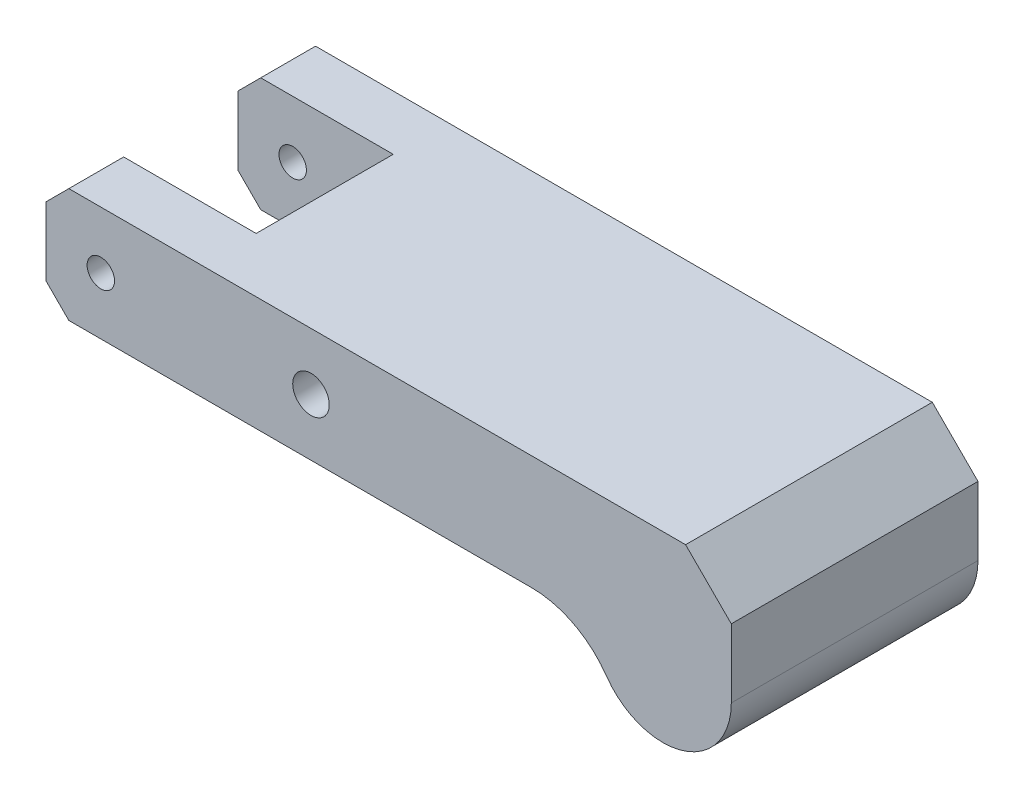
ISO-10303-21;
HEADER;
FILE_DESCRIPTION(('STEP AP214'),'2;1');
FILE_NAME('part.step','',(''),(''),'','','');
FILE_SCHEMA(('AUTOMOTIVE_DESIGN { 1 0 10303 214 1 1 1 1 }'));
ENDSEC;
DATA;
#1=APPLICATION_CONTEXT('core data for automotive mechanical design processes');
#2=APPLICATION_PROTOCOL_DEFINITION('international standard','automotive_design',2000,#1);
#3=PRODUCT_CONTEXT('',#1,'mechanical');
#4=PRODUCT('Part','Part','',(#3));
#5=PRODUCT_RELATED_PRODUCT_CATEGORY('part','',(#4));
#6=PRODUCT_DEFINITION_FORMATION('','',#4);
#7=PRODUCT_DEFINITION_CONTEXT('part definition',#1,'design');
#8=PRODUCT_DEFINITION('design','',#6,#7);
#9=PRODUCT_DEFINITION_SHAPE('','',#8);
#10=(LENGTH_UNIT() NAMED_UNIT(*) SI_UNIT(.MILLI.,.METRE.));
#11=(NAMED_UNIT(*) PLANE_ANGLE_UNIT() SI_UNIT($,.RADIAN.));
#12=(NAMED_UNIT(*) SI_UNIT($,.STERADIAN.) SOLID_ANGLE_UNIT());
#13=UNCERTAINTY_MEASURE_WITH_UNIT(LENGTH_MEASURE(1.E-05),#10,'distance_accuracy_value','');
#14=(GEOMETRIC_REPRESENTATION_CONTEXT(3) GLOBAL_UNCERTAINTY_ASSIGNED_CONTEXT((#13)) GLOBAL_UNIT_ASSIGNED_CONTEXT((#10,
#11,#12)) REPRESENTATION_CONTEXT('',''));
#15=CARTESIAN_POINT('',(0.,0.,0.));
#16=DIRECTION('',(0.,0.,1.));
#17=DIRECTION('',(1.,0.,0.));
#18=AXIS2_PLACEMENT_3D('',#15,#16,#17);
#19=CARTESIAN_POINT('',(-75.0000000000001,-12.5,54.));
#20=DIRECTION('',(1.,0.,0.));
#21=DIRECTION('',(0.,0.,-1.));
#22=AXIS2_PLACEMENT_3D('',#19,#20,#21);
#23=PLANE('',#22);
#24=DIRECTION('',(0.,1.,0.));
#25=VECTOR('',#24,1.);
#26=CARTESIAN_POINT('',(-75.0000000000001,-12.5,12.));
#27=LINE('',#26,#25);
#28=CARTESIAN_POINT('',(-75.0000000000001,-7.5,12.));
#29=VERTEX_POINT('',#28);
#30=CARTESIAN_POINT('',(-75.0000000000001,7.49999999999998,12.));
#31=VERTEX_POINT('',#30);
#32=EDGE_CURVE('E192',#29,#31,#27,.T.);
#33=ORIENTED_EDGE('',*,*,#32,.T.);
#34=DIRECTION('',(0.,0.,-1.));
#35=VECTOR('',#34,1.);
#36=CARTESIAN_POINT('',(-75.0000000000001,7.49999999999998,54.));
#37=LINE('',#36,#35);
#38=CARTESIAN_POINT('',(-75.0000000000001,7.49999999999998,0.));
#39=VERTEX_POINT('',#38);
#40=EDGE_CURVE('E261',#31,#39,#37,.T.);
#41=ORIENTED_EDGE('',*,*,#40,.T.);
#42=DIRECTION('',(0.,-1.,0.));
#43=VECTOR('',#42,1.);
#44=CARTESIAN_POINT('',(-75.0000000000001,-12.5,0.));
#45=LINE('',#44,#43);
#46=CARTESIAN_POINT('',(-75.0000000000001,-7.5,0.));
#47=VERTEX_POINT('',#46);
#48=EDGE_CURVE('E220',#39,#47,#45,.T.);
#49=ORIENTED_EDGE('',*,*,#48,.T.);
#50=DIRECTION('',(0.,0.,1.));
#51=VECTOR('',#50,1.);
#52=CARTESIAN_POINT('',(-75.0000000000001,-7.5,54.));
#53=LINE('',#52,#51);
#54=EDGE_CURVE('E253',#47,#29,#53,.T.);
#55=ORIENTED_EDGE('',*,*,#54,.T.);
#56=EDGE_LOOP('',(#33,#41,#49,#55));
#57=FACE_BOUND('',#56,.T.);
#58=ADVANCED_FACE('F40',(#57),#23,.F.);
#59=DIRECTION('',(0.,-1.,0.));
#60=VECTOR('',#59,1.);
#61=CARTESIAN_POINT('',(-75.0000000000001,-12.5,54.));
#62=LINE('',#61,#60);
#63=CARTESIAN_POINT('',(-75.0000000000001,7.49999999999998,54.));
#64=VERTEX_POINT('',#63);
#65=CARTESIAN_POINT('',(-75.0000000000001,-7.5,54.));
#66=VERTEX_POINT('',#65);
#67=EDGE_CURVE('E224',#64,#66,#62,.T.);
#68=ORIENTED_EDGE('',*,*,#67,.F.);
#69=DIRECTION('',(0.,0.,-1.));
#70=VECTOR('',#69,1.);
#71=CARTESIAN_POINT('',(-75.0000000000001,7.49999999999998,54.));
#72=LINE('',#71,#70);
#73=CARTESIAN_POINT('',(-75.0000000000001,7.49999999999998,42.));
#74=VERTEX_POINT('',#73);
#75=EDGE_CURVE('E288',#64,#74,#72,.T.);
#76=ORIENTED_EDGE('',*,*,#75,.T.);
#77=DIRECTION('',(0.,1.,0.));
#78=VECTOR('',#77,1.);
#79=CARTESIAN_POINT('',(-75.0000000000001,-12.5,42.));
#80=LINE('',#79,#78);
#81=CARTESIAN_POINT('',(-75.0000000000001,-7.5,42.));
#82=VERTEX_POINT('',#81);
#83=EDGE_CURVE('E172',#82,#74,#80,.T.);
#84=ORIENTED_EDGE('',*,*,#83,.F.);
#85=DIRECTION('',(0.,0.,1.));
#86=VECTOR('',#85,1.);
#87=CARTESIAN_POINT('',(-75.0000000000001,-7.5,54.));
#88=LINE('',#87,#86);
#89=EDGE_CURVE('E285',#82,#66,#88,.T.);
#90=ORIENTED_EDGE('',*,*,#89,.T.);
#91=EDGE_LOOP('',(#68,#76,#84,#90));
#92=FACE_BOUND('',#91,.T.);
#93=ADVANCED_FACE('F343',(#92),#23,.F.);
#94=CARTESIAN_POINT('',(74.9999999999999,-12.5,54.));
#95=DIRECTION('',(0.,1.,0.));
#96=DIRECTION('',(-1.,0.,0.));
#97=AXIS2_PLACEMENT_3D('',#94,#95,#96);
#98=PLANE('',#97);
#99=DIRECTION('',(1.,0.,0.));
#100=VECTOR('',#99,1.);
#101=CARTESIAN_POINT('',(74.9999999999999,-12.5,54.));
#102=LINE('',#101,#100);
#103=CARTESIAN_POINT('',(-70.0000000000001,-12.5,54.));
#104=VERTEX_POINT('',#103);
#105=CARTESIAN_POINT('',(31.2771867673098,-12.5,54.));
#106=VERTEX_POINT('',#105);
#107=EDGE_CURVE('E228',#104,#106,#102,.T.);
#108=ORIENTED_EDGE('',*,*,#107,.F.);
#109=DIRECTION('',(0.,0.,-1.));
#110=VECTOR('',#109,1.);
#111=CARTESIAN_POINT('',(-70.0000000000001,-12.5,54.));
#112=LINE('',#111,#110);
#113=CARTESIAN_POINT('',(-70.0000000000001,-12.5,42.));
#114=VERTEX_POINT('',#113);
#115=EDGE_CURVE('E156',#104,#114,#112,.T.);
#116=ORIENTED_EDGE('',*,*,#115,.T.);
#117=DIRECTION('',(1.,0.,0.));
#118=VECTOR('',#117,1.);
#119=CARTESIAN_POINT('',(-75.0000000000001,-12.5,42.));
#120=LINE('',#119,#118);
#121=CARTESIAN_POINT('',(-41.,-12.5,42.));
#122=VERTEX_POINT('',#121);
#123=EDGE_CURVE('E148',#114,#122,#120,.T.);
#124=ORIENTED_EDGE('',*,*,#123,.T.);
#125=DIRECTION('',(0.,0.,-1.));
#126=VECTOR('',#125,1.);
#127=CARTESIAN_POINT('',(-41.,-12.5,42.));
#128=LINE('',#127,#126);
#129=CARTESIAN_POINT('',(-41.,-12.5,12.));
#130=VERTEX_POINT('',#129);
#131=EDGE_CURVE('E154',#122,#130,#128,.T.);
#132=ORIENTED_EDGE('',*,*,#131,.T.);
#133=DIRECTION('',(-1.,0.,0.));
#134=VECTOR('',#133,1.);
#135=CARTESIAN_POINT('',(-75.0000000000001,-12.5,12.));
#136=LINE('',#135,#134);
#137=CARTESIAN_POINT('',(-70.0000000000001,-12.5,12.));
#138=VERTEX_POINT('',#137);
#139=EDGE_CURVE('E177',#130,#138,#136,.T.);
#140=ORIENTED_EDGE('',*,*,#139,.T.);
#141=DIRECTION('',(0.,0.,-1.));
#142=VECTOR('',#141,1.);
#143=CARTESIAN_POINT('',(-70.0000000000001,-12.5,54.));
#144=LINE('',#143,#142);
#145=CARTESIAN_POINT('',(-70.0000000000001,-12.5,0.));
#146=VERTEX_POINT('',#145);
#147=EDGE_CURVE('E304',#138,#146,#144,.T.);
#148=ORIENTED_EDGE('',*,*,#147,.T.);
#149=DIRECTION('',(1.,0.,0.));
#150=VECTOR('',#149,1.);
#151=CARTESIAN_POINT('',(74.9999999999999,-12.5,0.));
#152=LINE('',#151,#150);
#153=CARTESIAN_POINT('',(31.2771867673098,-12.5,0.));
#154=VERTEX_POINT('',#153);
#155=EDGE_CURVE('E242',#146,#154,#152,.T.);
#156=ORIENTED_EDGE('',*,*,#155,.T.);
#157=DIRECTION('',(0.,0.,-1.));
#158=VECTOR('',#157,1.);
#159=CARTESIAN_POINT('',(31.2771867673098,-12.5,54.));
#160=LINE('',#159,#158);
#161=EDGE_CURVE('E210',#106,#154,#160,.T.);
#162=ORIENTED_EDGE('',*,*,#161,.F.);
#163=EDGE_LOOP('',(#108,#116,#124,#132,#140,#148,#156,#162));
#164=FACE_BOUND('',#163,.T.);
#165=ADVANCED_FACE('F151',(#164),#98,.F.);
#166=CARTESIAN_POINT('',(74.9999999999999,-12.5,54.));
#167=DIRECTION('',(-1.,0.,0.));
#168=DIRECTION('',(0.,0.,1.));
#169=AXIS2_PLACEMENT_3D('',#166,#167,#168);
#170=PLANE('',#169);
#171=DIRECTION('',(0.,1.,0.));
#172=VECTOR('',#171,1.);
#173=CARTESIAN_POINT('',(74.9999999999999,-12.5,0.));
#174=LINE('',#173,#172);
#175=CARTESIAN_POINT('',(74.9999999999999,-12.5,0.));
#176=VERTEX_POINT('',#175);
#177=CARTESIAN_POINT('',(74.9999999999999,2.49999999999996,0.));
#178=VERTEX_POINT('',#177);
#179=EDGE_CURVE('E245',#176,#178,#174,.T.);
#180=ORIENTED_EDGE('',*,*,#179,.T.);
#181=DIRECTION('',(0.,0.,1.));
#182=VECTOR('',#181,1.);
#183=CARTESIAN_POINT('',(74.9999999999999,2.49999999999996,54.));
#184=LINE('',#183,#182);
#185=CARTESIAN_POINT('',(74.9999999999999,2.49999999999996,54.));
#186=VERTEX_POINT('',#185);
#187=EDGE_CURVE('E50',#178,#186,#184,.T.);
#188=ORIENTED_EDGE('',*,*,#187,.T.);
#189=DIRECTION('',(0.,1.,0.));
#190=VECTOR('',#189,1.);
#191=CARTESIAN_POINT('',(74.9999999999999,-12.5,54.));
#192=LINE('',#191,#190);
#193=CARTESIAN_POINT('',(74.9999999999999,-12.5,54.));
#194=VERTEX_POINT('',#193);
#195=EDGE_CURVE('E232',#194,#186,#192,.T.);
#196=ORIENTED_EDGE('',*,*,#195,.F.);
#197=DIRECTION('',(0.,0.,-1.));
#198=VECTOR('',#197,1.);
#199=CARTESIAN_POINT('',(74.9999999999999,-12.5,54.));
#200=LINE('',#199,#198);
#201=EDGE_CURVE('E238',#194,#176,#200,.T.);
#202=ORIENTED_EDGE('',*,*,#201,.T.);
#203=EDGE_LOOP('',(#180,#188,#196,#202));
#204=FACE_BOUND('',#203,.T.);
#205=ADVANCED_FACE('F359',(#204),#170,.F.);
#206=CARTESIAN_POINT('',(74.9999999999999,12.5,54.));
#207=DIRECTION('',(0.,-1.,0.));
#208=DIRECTION('',(1.,0.,0.));
#209=AXIS2_PLACEMENT_3D('',#206,#207,#208);
#210=PLANE('',#209);
#211=DIRECTION('',(-1.,0.,0.));
#212=VECTOR('',#211,1.);
#213=CARTESIAN_POINT('',(74.9999999999999,12.5,54.));
#214=LINE('',#213,#212);
#215=CARTESIAN_POINT('',(64.9999999999999,12.5,54.));
#216=VERTEX_POINT('',#215);
#217=CARTESIAN_POINT('',(-70.,12.5,54.));
#218=VERTEX_POINT('',#217);
#219=EDGE_CURVE('E235',#216,#218,#214,.T.);
#220=ORIENTED_EDGE('',*,*,#219,.F.);
#221=DIRECTION('',(0.,0.,-1.));
#222=VECTOR('',#221,1.);
#223=CARTESIAN_POINT('',(64.9999999999999,12.5,54.));
#224=LINE('',#223,#222);
#225=CARTESIAN_POINT('',(64.9999999999999,12.5,0.));
#226=VERTEX_POINT('',#225);
#227=EDGE_CURVE('E310',#216,#226,#224,.T.);
#228=ORIENTED_EDGE('',*,*,#227,.T.);
#229=DIRECTION('',(-1.,0.,0.));
#230=VECTOR('',#229,1.);
#231=CARTESIAN_POINT('',(74.9999999999999,12.5,0.));
#232=LINE('',#231,#230);
#233=CARTESIAN_POINT('',(-70.,12.5,0.));
#234=VERTEX_POINT('',#233);
#235=EDGE_CURVE('E229',#226,#234,#232,.T.);
#236=ORIENTED_EDGE('',*,*,#235,.T.);
#237=DIRECTION('',(0.,0.,1.));
#238=VECTOR('',#237,1.);
#239=CARTESIAN_POINT('',(-70.,12.5,54.));
#240=LINE('',#239,#238);
#241=CARTESIAN_POINT('',(-70.,12.5,12.));
#242=VERTEX_POINT('',#241);
#243=EDGE_CURVE('E276',#234,#242,#240,.T.);
#244=ORIENTED_EDGE('',*,*,#243,.T.);
#245=DIRECTION('',(-1.,0.,0.));
#246=VECTOR('',#245,1.);
#247=CARTESIAN_POINT('',(-75.0000000000001,12.5,12.));
#248=LINE('',#247,#246);
#249=CARTESIAN_POINT('',(-41.,12.5,12.));
#250=VERTEX_POINT('',#249);
#251=EDGE_CURVE('E159',#250,#242,#248,.T.);
#252=ORIENTED_EDGE('',*,*,#251,.F.);
#253=DIRECTION('',(0.,0.,-1.));
#254=VECTOR('',#253,1.);
#255=CARTESIAN_POINT('',(-41.,12.5,42.));
#256=LINE('',#255,#254);
#257=CARTESIAN_POINT('',(-41.,12.5,42.));
#258=VERTEX_POINT('',#257);
#259=EDGE_CURVE('E185',#258,#250,#256,.T.);
#260=ORIENTED_EDGE('',*,*,#259,.F.);
#261=DIRECTION('',(1.,0.,0.));
#262=VECTOR('',#261,1.);
#263=CARTESIAN_POINT('',(-75.0000000000001,12.5,42.));
#264=LINE('',#263,#262);
#265=CARTESIAN_POINT('',(-70.,12.5,42.));
#266=VERTEX_POINT('',#265);
#267=EDGE_CURVE('E166',#266,#258,#264,.T.);
#268=ORIENTED_EDGE('',*,*,#267,.F.);
#269=DIRECTION('',(0.,0.,1.));
#270=VECTOR('',#269,1.);
#271=CARTESIAN_POINT('',(-70.,12.5,54.));
#272=LINE('',#271,#270);
#273=EDGE_CURVE('E272',#266,#218,#272,.T.);
#274=ORIENTED_EDGE('',*,*,#273,.T.);
#275=EDGE_LOOP('',(#220,#228,#236,#244,#252,#260,#268,#274));
#276=FACE_BOUND('',#275,.T.);
#277=ADVANCED_FACE('F319',(#276),#210,.F.);
#278=CARTESIAN_POINT('',(0.,0.,54.));
#279=DIRECTION('',(0.,0.,1.));
#280=DIRECTION('',(1.,0.,0.));
#281=AXIS2_PLACEMENT_3D('',#278,#279,#280);
#282=PLANE('',#281);
#283=CARTESIAN_POINT('',(-17.,0.,54.));
#284=DIRECTION('',(0.,0.,-1.));
#285=DIRECTION('',(-1.,0.,0.));
#286=AXIS2_PLACEMENT_3D('',#283,#284,#285);
#287=CIRCLE('',#286,4.);
#288=CARTESIAN_POINT('',(-21.,0.,54.));
#289=VERTEX_POINT('',#288);
#290=EDGE_CURVE('E258',#289,#289,#287,.T.);
#291=ORIENTED_EDGE('',*,*,#290,.T.);
#292=EDGE_LOOP('',(#291));
#293=FACE_BOUND('',#292,.T.);
#294=CARTESIAN_POINT('',(-63.0000000000001,0.,54.));
#295=DIRECTION('',(0.,0.,-1.));
#296=DIRECTION('',(-1.,0.,0.));
#297=AXIS2_PLACEMENT_3D('',#294,#295,#296);
#298=CIRCLE('',#297,3.00000000000001);
#299=CARTESIAN_POINT('',(-66.0000000000001,0.,54.));
#300=VERTEX_POINT('',#299);
#301=EDGE_CURVE('E552',#300,#300,#298,.T.);
#302=ORIENTED_EDGE('',*,*,#301,.T.);
#303=EDGE_LOOP('',(#302));
#304=FACE_BOUND('',#303,.T.);
#305=ORIENTED_EDGE('',*,*,#195,.T.);
#306=DIRECTION('',(0.707106781186546,-0.70710678118655,0.));
#307=VECTOR('',#306,1.);
#308=CARTESIAN_POINT('',(38.7500000000002,38.75,54.));
#309=LINE('',#308,#307);
#310=EDGE_CURVE('E11',#186,#216,#309,.F.);
#311=ORIENTED_EDGE('',*,*,#310,.T.);
#312=ORIENTED_EDGE('',*,*,#219,.T.);
#313=DIRECTION('',(0.707106781186549,0.707106781186547,0.));
#314=VECTOR('',#313,1.);
#315=CARTESIAN_POINT('',(-41.2499999999999,41.25,54.));
#316=LINE('',#315,#314);
#317=EDGE_CURVE('E301',#218,#64,#316,.F.);
#318=ORIENTED_EDGE('',*,*,#317,.T.);
#319=ORIENTED_EDGE('',*,*,#67,.T.);
#320=DIRECTION('',(-0.707106781186546,0.70710678118655,0.));
#321=VECTOR('',#320,1.);
#322=CARTESIAN_POINT('',(-41.2500000000002,-41.25,54.));
#323=LINE('',#322,#321);
#324=EDGE_CURVE('E298',#66,#104,#323,.F.);
#325=ORIENTED_EDGE('',*,*,#324,.T.);
#326=ORIENTED_EDGE('',*,*,#107,.T.);
#327=CARTESIAN_POINT('',(31.2771867673098,-32.5,54.));
#328=DIRECTION('',(0.,0.,1.));
#329=DIRECTION('',(-1.,0.,0.));
#330=AXIS2_PLACEMENT_3D('',#327,#328,#329);
#331=CIRCLE('',#330,20.);
#332=CARTESIAN_POINT('',(47.6902229002756,-21.0714285714286,54.));
#333=VERTEX_POINT('',#332);
#334=EDGE_CURVE('E201',#333,#106,#331,.T.);
#335=ORIENTED_EDGE('',*,*,#334,.F.);
#336=CARTESIAN_POINT('',(60.,-12.5,54.));
#337=DIRECTION('',(0.,0.,-1.));
#338=DIRECTION('',(-1.,0.,0.));
#339=AXIS2_PLACEMENT_3D('',#336,#337,#338);
#340=CIRCLE('',#339,15.);
#341=EDGE_CURVE('E205',#194,#333,#340,.T.);
#342=ORIENTED_EDGE('',*,*,#341,.F.);
#343=EDGE_LOOP('',(#305,#311,#312,#318,#319,#325,#326,#335,#342));
#344=FACE_BOUND('',#343,.T.);
#345=ADVANCED_FACE('F340',(#293,#304,#344),#282,.T.);
#346=CARTESIAN_POINT('',(0.,0.,0.));
#347=DIRECTION('',(0.,0.,1.));
#348=DIRECTION('',(1.,0.,0.));
#349=AXIS2_PLACEMENT_3D('',#346,#347,#348);
#350=PLANE('',#349);
#351=CARTESIAN_POINT('',(-17.,0.,0.));
#352=DIRECTION('',(0.,0.,-1.));
#353=DIRECTION('',(-1.,0.,0.));
#354=AXIS2_PLACEMENT_3D('',#351,#352,#353);
#355=CIRCLE('',#354,4.);
#356=CARTESIAN_POINT('',(-21.,0.,0.));
#357=VERTEX_POINT('',#356);
#358=EDGE_CURVE('E550',#357,#357,#355,.T.);
#359=ORIENTED_EDGE('',*,*,#358,.F.);
#360=EDGE_LOOP('',(#359));
#361=FACE_BOUND('',#360,.T.);
#362=CARTESIAN_POINT('',(-63.0000000000001,0.,0.));
#363=DIRECTION('',(0.,0.,-1.));
#364=DIRECTION('',(-1.,0.,0.));
#365=AXIS2_PLACEMENT_3D('',#362,#363,#364);
#366=CIRCLE('',#365,3.00000000000001);
#367=CARTESIAN_POINT('',(-66.0000000000001,0.,0.));
#368=VERTEX_POINT('',#367);
#369=EDGE_CURVE('E558',#368,#368,#366,.T.);
#370=ORIENTED_EDGE('',*,*,#369,.F.);
#371=EDGE_LOOP('',(#370));
#372=FACE_BOUND('',#371,.T.);
#373=ORIENTED_EDGE('',*,*,#235,.F.);
#374=DIRECTION('',(-0.707106781186546,0.70710678118655,0.));
#375=VECTOR('',#374,1.);
#376=CARTESIAN_POINT('',(64.9999999999999,12.5,0.));
#377=LINE('',#376,#375);
#378=EDGE_CURVE('E64',#226,#178,#377,.F.);
#379=ORIENTED_EDGE('',*,*,#378,.T.);
#380=ORIENTED_EDGE('',*,*,#179,.F.);
#381=CARTESIAN_POINT('',(60.,-12.5,0.));
#382=DIRECTION('',(0.,0.,-1.));
#383=DIRECTION('',(-1.,0.,0.));
#384=AXIS2_PLACEMENT_3D('',#381,#382,#383);
#385=CIRCLE('',#384,15.);
#386=CARTESIAN_POINT('',(47.6902229002756,-21.0714285714286,0.));
#387=VERTEX_POINT('',#386);
#388=EDGE_CURVE('E206',#176,#387,#385,.T.);
#389=ORIENTED_EDGE('',*,*,#388,.T.);
#390=CARTESIAN_POINT('',(31.2771867673098,-32.5,0.));
#391=DIRECTION('',(0.,0.,1.));
#392=DIRECTION('',(-1.,0.,0.));
#393=AXIS2_PLACEMENT_3D('',#390,#391,#392);
#394=CIRCLE('',#393,20.);
#395=EDGE_CURVE('E196',#387,#154,#394,.T.);
#396=ORIENTED_EDGE('',*,*,#395,.T.);
#397=ORIENTED_EDGE('',*,*,#155,.F.);
#398=DIRECTION('',(0.707106781186546,-0.70710678118655,0.));
#399=VECTOR('',#398,1.);
#400=CARTESIAN_POINT('',(-70.0000000000001,-12.5,0.));
#401=LINE('',#400,#399);
#402=EDGE_CURVE('E265',#146,#47,#401,.F.);
#403=ORIENTED_EDGE('',*,*,#402,.T.);
#404=ORIENTED_EDGE('',*,*,#48,.F.);
#405=DIRECTION('',(-0.707106781186549,-0.707106781186547,0.));
#406=VECTOR('',#405,1.);
#407=CARTESIAN_POINT('',(-75.0000000000001,7.49999999999998,0.));
#408=LINE('',#407,#406);
#409=EDGE_CURVE('E268',#39,#234,#408,.F.);
#410=ORIENTED_EDGE('',*,*,#409,.T.);
#411=EDGE_LOOP('',(#373,#379,#380,#389,#396,#397,#403,#404,#410));
#412=FACE_BOUND('',#411,.T.);
#413=ADVANCED_FACE('F322',(#361,#372,#412),#350,.F.);
#414=CARTESIAN_POINT('',(31.2771867673098,-32.5,54.));
#415=DIRECTION('',(0.,0.,-1.));
#416=DIRECTION('',(-1.,0.,0.));
#417=AXIS2_PLACEMENT_3D('',#414,#415,#416);
#418=CYLINDRICAL_SURFACE('',#417,20.);
#419=ORIENTED_EDGE('',*,*,#395,.F.);
#420=DIRECTION('',(0.,0.,-1.));
#421=VECTOR('',#420,1.);
#422=CARTESIAN_POINT('',(47.6902229002756,-21.0714285714286,54.));
#423=LINE('',#422,#421);
#424=EDGE_CURVE('E217',#333,#387,#423,.T.);
#425=ORIENTED_EDGE('',*,*,#424,.F.);
#426=ORIENTED_EDGE('',*,*,#334,.T.);
#427=ORIENTED_EDGE('',*,*,#161,.T.);
#428=EDGE_LOOP('',(#419,#425,#426,#427));
#429=FACE_BOUND('',#428,.T.);
#430=ADVANCED_FACE('F353',(#429),#418,.F.);
#431=CARTESIAN_POINT('',(60.,-12.5,54.));
#432=DIRECTION('',(0.,0.,-1.));
#433=DIRECTION('',(-1.,0.,0.));
#434=AXIS2_PLACEMENT_3D('',#431,#432,#433);
#435=CYLINDRICAL_SURFACE('',#434,15.);
#436=ORIENTED_EDGE('',*,*,#388,.F.);
#437=ORIENTED_EDGE('',*,*,#201,.F.);
#438=ORIENTED_EDGE('',*,*,#341,.T.);
#439=ORIENTED_EDGE('',*,*,#424,.T.);
#440=EDGE_LOOP('',(#436,#437,#438,#439));
#441=FACE_BOUND('',#440,.T.);
#442=ADVANCED_FACE('F358',(#441),#435,.T.);
#443=CARTESIAN_POINT('',(-75.0000000000001,-12.5,12.));
#444=DIRECTION('',(0.,0.,-1.));
#445=DIRECTION('',(-1.,0.,0.));
#446=AXIS2_PLACEMENT_3D('',#443,#444,#445);
#447=PLANE('',#446);
#448=CARTESIAN_POINT('',(-63.0000000000001,0.,12.));
#449=DIRECTION('',(0.,0.,-1.));
#450=DIRECTION('',(-1.,0.,0.));
#451=AXIS2_PLACEMENT_3D('',#448,#449,#450);
#452=CIRCLE('',#451,3.00000000000001);
#453=CARTESIAN_POINT('',(-66.0000000000001,0.,12.));
#454=VERTEX_POINT('',#453);
#455=EDGE_CURVE('E186',#454,#454,#452,.T.);
#456=ORIENTED_EDGE('',*,*,#455,.T.);
#457=EDGE_LOOP('',(#456));
#458=FACE_BOUND('',#457,.T.);
#459=ORIENTED_EDGE('',*,*,#251,.T.);
#460=DIRECTION('',(0.707106781186549,0.707106781186547,0.));
#461=VECTOR('',#460,1.);
#462=CARTESIAN_POINT('',(-75.0000000000001,7.49999999999998,12.));
#463=LINE('',#462,#461);
#464=EDGE_CURVE('E282',#242,#31,#463,.F.);
#465=ORIENTED_EDGE('',*,*,#464,.T.);
#466=ORIENTED_EDGE('',*,*,#32,.F.);
#467=DIRECTION('',(-0.707106781186546,0.70710678118655,0.));
#468=VECTOR('',#467,1.);
#469=CARTESIAN_POINT('',(-70.0000000000001,-12.5,12.));
#470=LINE('',#469,#468);
#471=EDGE_CURVE('E279',#29,#138,#470,.F.);
#472=ORIENTED_EDGE('',*,*,#471,.T.);
#473=ORIENTED_EDGE('',*,*,#139,.F.);
#474=DIRECTION('',(0.,1.,0.));
#475=VECTOR('',#474,1.);
#476=CARTESIAN_POINT('',(-41.,-12.5,12.));
#477=LINE('',#476,#475);
#478=EDGE_CURVE('E171',#130,#250,#477,.T.);
#479=ORIENTED_EDGE('',*,*,#478,.T.);
#480=EDGE_LOOP('',(#459,#465,#466,#472,#473,#479));
#481=FACE_BOUND('',#480,.T.);
#482=ADVANCED_FACE('F331',(#458,#481),#447,.F.);
#483=CARTESIAN_POINT('',(-41.,-12.5,42.));
#484=DIRECTION('',(1.,0.,0.));
#485=DIRECTION('',(0.,1.,0.));
#486=AXIS2_PLACEMENT_3D('',#483,#484,#485);
#487=PLANE('',#486);
#488=ORIENTED_EDGE('',*,*,#259,.T.);
#489=ORIENTED_EDGE('',*,*,#478,.F.);
#490=ORIENTED_EDGE('',*,*,#131,.F.);
#491=DIRECTION('',(0.,1.,0.));
#492=VECTOR('',#491,1.);
#493=CARTESIAN_POINT('',(-41.,-12.5,42.));
#494=LINE('',#493,#492);
#495=EDGE_CURVE('E162',#122,#258,#494,.T.);
#496=ORIENTED_EDGE('',*,*,#495,.T.);
#497=EDGE_LOOP('',(#488,#489,#490,#496));
#498=FACE_BOUND('',#497,.T.);
#499=ADVANCED_FACE('F174',(#498),#487,.F.);
#500=CARTESIAN_POINT('',(-75.0000000000001,-12.5,42.));
#501=DIRECTION('',(0.,0.,1.));
#502=DIRECTION('',(1.,0.,0.));
#503=AXIS2_PLACEMENT_3D('',#500,#501,#502);
#504=PLANE('',#503);
#505=CARTESIAN_POINT('',(-63.0000000000001,0.,42.));
#506=DIRECTION('',(0.,0.,1.));
#507=DIRECTION('',(1.,0.,0.));
#508=AXIS2_PLACEMENT_3D('',#505,#506,#507);
#509=CIRCLE('',#508,3.00000000000001);
#510=CARTESIAN_POINT('',(-60.,0.,42.));
#511=VERTEX_POINT('',#510);
#512=EDGE_CURVE('E254',#511,#511,#509,.T.);
#513=ORIENTED_EDGE('',*,*,#512,.T.);
#514=EDGE_LOOP('',(#513));
#515=FACE_BOUND('',#514,.T.);
#516=ORIENTED_EDGE('',*,*,#83,.T.);
#517=DIRECTION('',(-0.707106781186549,-0.707106781186547,0.));
#518=VECTOR('',#517,1.);
#519=CARTESIAN_POINT('',(-75.0000000000001,7.49999999999998,42.));
#520=LINE('',#519,#518);
#521=EDGE_CURVE('E295',#74,#266,#520,.F.);
#522=ORIENTED_EDGE('',*,*,#521,.T.);
#523=ORIENTED_EDGE('',*,*,#267,.T.);
#524=ORIENTED_EDGE('',*,*,#495,.F.);
#525=ORIENTED_EDGE('',*,*,#123,.F.);
#526=DIRECTION('',(0.707106781186546,-0.70710678118655,0.));
#527=VECTOR('',#526,1.);
#528=CARTESIAN_POINT('',(-70.0000000000001,-12.5,42.));
#529=LINE('',#528,#527);
#530=EDGE_CURVE('E292',#114,#82,#529,.F.);
#531=ORIENTED_EDGE('',*,*,#530,.T.);
#532=EDGE_LOOP('',(#516,#522,#523,#524,#525,#531));
#533=FACE_BOUND('',#532,.T.);
#534=ADVANCED_FACE('F164',(#515,#533),#504,.F.);
#535=CARTESIAN_POINT('',(-63.0000000000001,0.,54.));
#536=DIRECTION('',(0.,0.,-1.));
#537=DIRECTION('',(-1.,0.,0.));
#538=AXIS2_PLACEMENT_3D('',#535,#536,#537);
#539=CYLINDRICAL_SURFACE('',#538,3.00000000000001);
#540=ORIENTED_EDGE('',*,*,#301,.F.);
#541=EDGE_LOOP('',(#540));
#542=FACE_BOUND('',#541,.T.);
#543=ORIENTED_EDGE('',*,*,#512,.F.);
#544=EDGE_LOOP('',(#543));
#545=FACE_BOUND('',#544,.T.);
#546=ADVANCED_FACE('F479',(#542,#545),#539,.F.);
#547=ORIENTED_EDGE('',*,*,#369,.T.);
#548=EDGE_LOOP('',(#547));
#549=FACE_BOUND('',#548,.T.);
#550=ORIENTED_EDGE('',*,*,#455,.F.);
#551=EDGE_LOOP('',(#550));
#552=FACE_BOUND('',#551,.T.);
#553=ADVANCED_FACE('F487',(#549,#552),#539,.F.);
#554=CARTESIAN_POINT('',(-17.,0.,54.));
#555=DIRECTION('',(0.,0.,-1.));
#556=DIRECTION('',(-1.,0.,0.));
#557=AXIS2_PLACEMENT_3D('',#554,#555,#556);
#558=CYLINDRICAL_SURFACE('',#557,4.);
#559=ORIENTED_EDGE('',*,*,#290,.F.);
#560=EDGE_LOOP('',(#559));
#561=FACE_BOUND('',#560,.T.);
#562=ORIENTED_EDGE('',*,*,#358,.T.);
#563=EDGE_LOOP('',(#562));
#564=FACE_BOUND('',#563,.T.);
#565=ADVANCED_FACE('F381',(#561,#564),#558,.F.);
#566=CARTESIAN_POINT('',(-75.0000000000001,7.49999999999998,54.));
#567=DIRECTION('',(0.707106781186546,-0.707106781186548,0.));
#568=DIRECTION('',(0.,0.,-1.));
#569=AXIS2_PLACEMENT_3D('',#566,#567,#568);
#570=PLANE('',#569);
#571=ORIENTED_EDGE('',*,*,#464,.F.);
#572=ORIENTED_EDGE('',*,*,#243,.F.);
#573=ORIENTED_EDGE('',*,*,#409,.F.);
#574=ORIENTED_EDGE('',*,*,#40,.F.);
#575=EDGE_LOOP('',(#571,#572,#573,#574));
#576=FACE_BOUND('',#575,.T.);
#577=ADVANCED_FACE('F328',(#576),#570,.F.);
#578=CARTESIAN_POINT('',(-75.0000000000001,7.49999999999998,54.));
#579=DIRECTION('',(0.707106781186546,-0.707106781186548,0.));
#580=DIRECTION('',(0.,0.,-1.));
#581=AXIS2_PLACEMENT_3D('',#578,#579,#580);
#582=PLANE('',#581);
#583=ORIENTED_EDGE('',*,*,#317,.F.);
#584=ORIENTED_EDGE('',*,*,#273,.F.);
#585=ORIENTED_EDGE('',*,*,#521,.F.);
#586=ORIENTED_EDGE('',*,*,#75,.F.);
#587=EDGE_LOOP('',(#583,#584,#585,#586));
#588=FACE_BOUND('',#587,.T.);
#589=ADVANCED_FACE('F336',(#588),#582,.F.);
#590=CARTESIAN_POINT('',(-70.0000000000001,-12.5,54.));
#591=DIRECTION('',(0.70710678118655,0.707106781186546,0.));
#592=DIRECTION('',(0.,0.,-1.));
#593=AXIS2_PLACEMENT_3D('',#590,#591,#592);
#594=PLANE('',#593);
#595=ORIENTED_EDGE('',*,*,#324,.F.);
#596=ORIENTED_EDGE('',*,*,#89,.F.);
#597=ORIENTED_EDGE('',*,*,#530,.F.);
#598=ORIENTED_EDGE('',*,*,#115,.F.);
#599=EDGE_LOOP('',(#595,#596,#597,#598));
#600=FACE_BOUND('',#599,.T.);
#601=ADVANCED_FACE('F347',(#600),#594,.F.);
#602=CARTESIAN_POINT('',(-70.0000000000001,-12.5,54.));
#603=DIRECTION('',(0.70710678118655,0.707106781186546,0.));
#604=DIRECTION('',(0.,0.,-1.));
#605=AXIS2_PLACEMENT_3D('',#602,#603,#604);
#606=PLANE('',#605);
#607=ORIENTED_EDGE('',*,*,#471,.F.);
#608=ORIENTED_EDGE('',*,*,#54,.F.);
#609=ORIENTED_EDGE('',*,*,#402,.F.);
#610=ORIENTED_EDGE('',*,*,#147,.F.);
#611=EDGE_LOOP('',(#607,#608,#609,#610));
#612=FACE_BOUND('',#611,.T.);
#613=ADVANCED_FACE('F361',(#612),#606,.F.);
#614=CARTESIAN_POINT('',(64.9999999999999,12.5,54.));
#615=DIRECTION('',(-0.70710678118655,-0.707106781186546,0.));
#616=DIRECTION('',(0.,0.,-1.));
#617=AXIS2_PLACEMENT_3D('',#614,#615,#616);
#618=PLANE('',#617);
#619=ORIENTED_EDGE('',*,*,#310,.F.);
#620=ORIENTED_EDGE('',*,*,#187,.F.);
#621=ORIENTED_EDGE('',*,*,#378,.F.);
#622=ORIENTED_EDGE('',*,*,#227,.F.);
#623=EDGE_LOOP('',(#619,#620,#621,#622));
#624=FACE_BOUND('',#623,.T.);
#625=ADVANCED_FACE('F43',(#624),#618,.F.);
#626=CLOSED_SHELL('',(#58,#93,#165,#205,#277,#345,#413,#430,#442,#482,#499,#534,#546,#553,#565,
#577,#589,#601,#613,#625));
#627=MANIFOLD_SOLID_BREP('B2',#626);
#628=ADVANCED_BREP_SHAPE_REPRESENTATION('',(#18,#627),#14);
#629=SHAPE_DEFINITION_REPRESENTATION(#9,#628);
ENDSEC;
END-ISO-10303-21;
